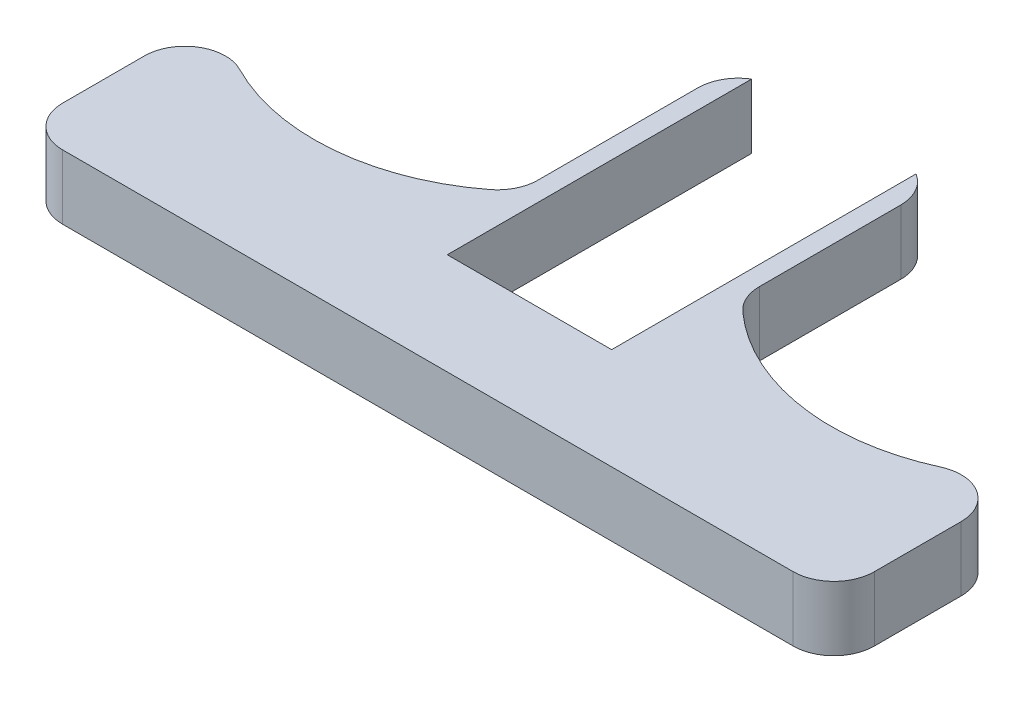
ISO-10303-21;
HEADER;
FILE_DESCRIPTION(('STEP AP214'),'2;1');
FILE_NAME('part.step','',(''),(''),'','','');
FILE_SCHEMA(('AUTOMOTIVE_DESIGN { 1 0 10303 214 1 1 1 1 }'));
ENDSEC;
DATA;
#1=APPLICATION_CONTEXT('core data for automotive mechanical design processes');
#2=APPLICATION_PROTOCOL_DEFINITION('international standard','automotive_design',2000,#1);
#3=PRODUCT_CONTEXT('',#1,'mechanical');
#4=PRODUCT('Part','Part','',(#3));
#5=PRODUCT_RELATED_PRODUCT_CATEGORY('part','',(#4));
#6=PRODUCT_DEFINITION_FORMATION('','',#4);
#7=PRODUCT_DEFINITION_CONTEXT('part definition',#1,'design');
#8=PRODUCT_DEFINITION('design','',#6,#7);
#9=PRODUCT_DEFINITION_SHAPE('','',#8);
#10=(LENGTH_UNIT() NAMED_UNIT(*) SI_UNIT(.MILLI.,.METRE.));
#11=(NAMED_UNIT(*) PLANE_ANGLE_UNIT() SI_UNIT($,.RADIAN.));
#12=(NAMED_UNIT(*) SI_UNIT($,.STERADIAN.) SOLID_ANGLE_UNIT());
#13=UNCERTAINTY_MEASURE_WITH_UNIT(LENGTH_MEASURE(1.E-05),#10,'distance_accuracy_value','');
#14=(GEOMETRIC_REPRESENTATION_CONTEXT(3) GLOBAL_UNCERTAINTY_ASSIGNED_CONTEXT((#13)) GLOBAL_UNIT_ASSIGNED_CONTEXT((#10,
#11,#12)) REPRESENTATION_CONTEXT('',''));
#15=CARTESIAN_POINT('',(0.,0.,0.));
#16=DIRECTION('',(0.,0.,1.));
#17=DIRECTION('',(1.,0.,0.));
#18=AXIS2_PLACEMENT_3D('',#15,#16,#17);
#19=CARTESIAN_POINT('',(0.,3.175,0.));
#20=DIRECTION('',(1.,0.,0.));
#21=DIRECTION('',(0.,0.,-1.));
#22=AXIS2_PLACEMENT_3D('',#19,#20,#21);
#23=PLANE('',#22);
#24=DIRECTION('',(0.,0.,1.));
#25=VECTOR('',#24,1.);
#26=CARTESIAN_POINT('',(0.,0.,0.));
#27=LINE('',#26,#25);
#28=CARTESIAN_POINT('',(0.,0.,-6.02246572622985));
#29=VERTEX_POINT('',#28);
#30=CARTESIAN_POINT('',(0.,0.,-2.));
#31=VERTEX_POINT('',#30);
#32=EDGE_CURVE('E266',#29,#31,#27,.T.);
#33=ORIENTED_EDGE('',*,*,#32,.T.);
#34=DIRECTION('',(0.,-1.,0.));
#35=VECTOR('',#34,1.);
#36=CARTESIAN_POINT('',(0.,3.175,-2.));
#37=LINE('',#36,#35);
#38=CARTESIAN_POINT('',(0.,3.175,-2.));
#39=VERTEX_POINT('',#38);
#40=EDGE_CURVE('E55',#31,#39,#37,.F.);
#41=ORIENTED_EDGE('',*,*,#40,.T.);
#42=DIRECTION('',(0.,0.,1.));
#43=VECTOR('',#42,1.);
#44=CARTESIAN_POINT('',(0.,3.175,0.));
#45=LINE('',#44,#43);
#46=CARTESIAN_POINT('',(0.,3.175,-6.02246572622985));
#47=VERTEX_POINT('',#46);
#48=EDGE_CURVE('E252',#47,#39,#45,.T.);
#49=ORIENTED_EDGE('',*,*,#48,.F.);
#50=DIRECTION('',(0.,-1.,0.));
#51=VECTOR('',#50,1.);
#52=CARTESIAN_POINT('',(0.,3.175,-6.02246572622985));
#53=LINE('',#52,#51);
#54=EDGE_CURVE('E228',#47,#29,#53,.T.);
#55=ORIENTED_EDGE('',*,*,#54,.T.);
#56=EDGE_LOOP('',(#33,#41,#49,#55));
#57=FACE_BOUND('',#56,.T.);
#58=ADVANCED_FACE('F32',(#57),#23,.F.);
#59=CARTESIAN_POINT('',(0.,3.175,0.));
#60=DIRECTION('',(0.,0.,-1.));
#61=DIRECTION('',(-1.,0.,0.));
#62=AXIS2_PLACEMENT_3D('',#59,#60,#61);
#63=PLANE('',#62);
#64=DIRECTION('',(1.,0.,0.));
#65=VECTOR('',#64,1.);
#66=CARTESIAN_POINT('',(0.,3.175,0.));
#67=LINE('',#66,#65);
#68=CARTESIAN_POINT('',(2.,3.175,0.));
#69=VERTEX_POINT('',#68);
#70=CARTESIAN_POINT('',(38.,3.175,0.));
#71=VERTEX_POINT('',#70);
#72=EDGE_CURVE('E251',#69,#71,#67,.T.);
#73=ORIENTED_EDGE('',*,*,#72,.F.);
#74=DIRECTION('',(0.,-1.,0.));
#75=VECTOR('',#74,1.);
#76=CARTESIAN_POINT('',(2.,3.175,0.));
#77=LINE('',#76,#75);
#78=CARTESIAN_POINT('',(2.,0.,0.));
#79=VERTEX_POINT('',#78);
#80=EDGE_CURVE('E241',#69,#79,#77,.T.);
#81=ORIENTED_EDGE('',*,*,#80,.T.);
#82=DIRECTION('',(1.,0.,0.));
#83=VECTOR('',#82,1.);
#84=CARTESIAN_POINT('',(0.,0.,0.));
#85=LINE('',#84,#83);
#86=CARTESIAN_POINT('',(38.,0.,0.));
#87=VERTEX_POINT('',#86);
#88=EDGE_CURVE('E267',#79,#87,#85,.T.);
#89=ORIENTED_EDGE('',*,*,#88,.T.);
#90=DIRECTION('',(0.,-1.,0.));
#91=VECTOR('',#90,1.);
#92=CARTESIAN_POINT('',(38.,3.175,0.));
#93=LINE('',#92,#91);
#94=EDGE_CURVE('E239',#87,#71,#93,.F.);
#95=ORIENTED_EDGE('',*,*,#94,.T.);
#96=EDGE_LOOP('',(#73,#81,#89,#95));
#97=FACE_BOUND('',#96,.T.);
#98=ADVANCED_FACE('F256',(#97),#63,.F.);
#99=CARTESIAN_POINT('',(40.,3.175,0.));
#100=DIRECTION('',(-1.,0.,0.));
#101=DIRECTION('',(0.,0.,1.));
#102=AXIS2_PLACEMENT_3D('',#99,#100,#101);
#103=PLANE('',#102);
#104=DIRECTION('',(0.,0.,-1.));
#105=VECTOR('',#104,1.);
#106=CARTESIAN_POINT('',(40.,3.175,0.));
#107=LINE('',#106,#105);
#108=CARTESIAN_POINT('',(40.,3.175,-2.));
#109=VERTEX_POINT('',#108);
#110=CARTESIAN_POINT('',(40.,3.175,-6.28052182092179));
#111=VERTEX_POINT('',#110);
#112=EDGE_CURVE('E260',#109,#111,#107,.T.);
#113=ORIENTED_EDGE('',*,*,#112,.F.);
#114=DIRECTION('',(0.,-1.,0.));
#115=VECTOR('',#114,1.);
#116=CARTESIAN_POINT('',(40.,3.175,-2.));
#117=LINE('',#116,#115);
#118=CARTESIAN_POINT('',(40.,0.,-2.));
#119=VERTEX_POINT('',#118);
#120=EDGE_CURVE('E11',#109,#119,#117,.T.);
#121=ORIENTED_EDGE('',*,*,#120,.T.);
#122=DIRECTION('',(0.,0.,-1.));
#123=VECTOR('',#122,1.);
#124=CARTESIAN_POINT('',(40.,0.,0.));
#125=LINE('',#124,#123);
#126=CARTESIAN_POINT('',(40.,0.,-6.28052182092179));
#127=VERTEX_POINT('',#126);
#128=EDGE_CURVE('E270',#119,#127,#125,.T.);
#129=ORIENTED_EDGE('',*,*,#128,.T.);
#130=DIRECTION('',(0.,-1.,0.));
#131=VECTOR('',#130,1.);
#132=CARTESIAN_POINT('',(40.,3.175,-6.28052182092179));
#133=LINE('',#132,#131);
#134=EDGE_CURVE('E236',#127,#111,#133,.F.);
#135=ORIENTED_EDGE('',*,*,#134,.T.);
#136=EDGE_LOOP('',(#113,#121,#129,#135));
#137=FACE_BOUND('',#136,.T.);
#138=ADVANCED_FACE('F330',(#137),#103,.F.);
#139=CARTESIAN_POINT('',(32.75,3.175,-17.741931283601));
#140=DIRECTION('',(0.,-1.,0.));
#141=DIRECTION('',(0.,0.,-1.));
#142=AXIS2_PLACEMENT_3D('',#139,#140,#141);
#143=CYLINDRICAL_SURFACE('',#142,10.6066017177982);
#144=CARTESIAN_POINT('',(32.75,3.175,-17.741931283601));
#145=DIRECTION('',(0.,-1.,0.));
#146=DIRECTION('',(0.,0.,-1.));
#147=AXIS2_PLACEMENT_3D('',#144,#145,#146);
#148=CIRCLE('',#147,10.6066017177982);
#149=CARTESIAN_POINT('',(37.1671030595679,3.175,-8.09884046368463));
#150=VERTEX_POINT('',#149);
#151=CARTESIAN_POINT('',(25.663816407791,3.175,-9.84978315413032));
#152=VERTEX_POINT('',#151);
#153=EDGE_CURVE('E322',#150,#152,#148,.T.);
#154=ORIENTED_EDGE('',*,*,#153,.F.);
#155=DIRECTION('',(0.,-1.,0.));
#156=VECTOR('',#155,1.);
#157=CARTESIAN_POINT('',(37.1671030595679,3.175,-8.09884046368463));
#158=LINE('',#157,#156);
#159=CARTESIAN_POINT('',(37.1671030595679,0.,-8.09884046368463));
#160=VERTEX_POINT('',#159);
#161=EDGE_CURVE('E233',#150,#160,#158,.T.);
#162=ORIENTED_EDGE('',*,*,#161,.T.);
#163=CARTESIAN_POINT('',(32.75,0.,-17.741931283601));
#164=DIRECTION('',(0.,-1.,0.));
#165=DIRECTION('',(0.,0.,-1.));
#166=AXIS2_PLACEMENT_3D('',#163,#164,#165);
#167=CIRCLE('',#166,10.6066017177982);
#168=CARTESIAN_POINT('',(25.663816407791,0.,-9.84978315413032));
#169=VERTEX_POINT('',#168);
#170=EDGE_CURVE('E277',#160,#169,#167,.T.);
#171=ORIENTED_EDGE('',*,*,#170,.T.);
#172=DIRECTION('',(0.,-1.,0.));
#173=VECTOR('',#172,1.);
#174=CARTESIAN_POINT('',(25.663816407791,3.175,-9.84978315413032));
#175=LINE('',#174,#173);
#176=EDGE_CURVE('E198',#169,#152,#175,.F.);
#177=ORIENTED_EDGE('',*,*,#176,.T.);
#178=EDGE_LOOP('',(#154,#162,#171,#177));
#179=FACE_BOUND('',#178,.T.);
#180=ADVANCED_FACE('F337',(#179),#143,.F.);
#181=CARTESIAN_POINT('',(25.,3.175,-20.0021468283073));
#182=DIRECTION('',(-1.,0.,0.));
#183=DIRECTION('',(0.,0.,1.));
#184=AXIS2_PLACEMENT_3D('',#181,#182,#183);
#185=PLANE('',#184);
#186=DIRECTION('',(0.,0.,-1.));
#187=VECTOR('',#186,1.);
#188=CARTESIAN_POINT('',(25.,0.,-20.0021468283073));
#189=LINE('',#188,#187);
#190=CARTESIAN_POINT('',(25.,0.,-11.3379408769243));
#191=VERTEX_POINT('',#190);
#192=CARTESIAN_POINT('',(25.,0.,-18.2999423752524));
#193=VERTEX_POINT('',#192);
#194=EDGE_CURVE('E279',#191,#193,#189,.T.);
#195=ORIENTED_EDGE('',*,*,#194,.T.);
#196=DIRECTION('',(0.,1.,0.));
#197=VECTOR('',#196,1.);
#198=CARTESIAN_POINT('',(25.,3.175,-18.2999423752524));
#199=LINE('',#198,#197);
#200=CARTESIAN_POINT('',(25.,3.175,-18.2999423752524));
#201=VERTEX_POINT('',#200);
#202=EDGE_CURVE('E219',#193,#201,#199,.T.);
#203=ORIENTED_EDGE('',*,*,#202,.T.);
#204=DIRECTION('',(0.,0.,-1.));
#205=VECTOR('',#204,1.);
#206=CARTESIAN_POINT('',(25.,3.175,-20.0021468283073));
#207=LINE('',#206,#205);
#208=CARTESIAN_POINT('',(25.,3.175,-11.3379408769243));
#209=VERTEX_POINT('',#208);
#210=EDGE_CURVE('E165',#209,#201,#207,.T.);
#211=ORIENTED_EDGE('',*,*,#210,.F.);
#212=DIRECTION('',(0.,1.,0.));
#213=VECTOR('',#212,1.);
#214=CARTESIAN_POINT('',(25.,0.,-11.3379408769243));
#215=LINE('',#214,#213);
#216=EDGE_CURVE('E195',#209,#191,#215,.F.);
#217=ORIENTED_EDGE('',*,*,#216,.T.);
#218=EDGE_LOOP('',(#195,#203,#211,#217));
#219=FACE_BOUND('',#218,.T.);
#220=ADVANCED_FACE('F345',(#219),#185,.F.);
#221=CARTESIAN_POINT('',(24.05,3.175,-20.0021468283073));
#222=DIRECTION('',(1.,0.,0.));
#223=DIRECTION('',(0.,0.,-1.));
#224=AXIS2_PLACEMENT_3D('',#221,#222,#223);
#225=PLANE('',#224);
#226=DIRECTION('',(0.,0.,1.));
#227=VECTOR('',#226,1.);
#228=CARTESIAN_POINT('',(24.05,0.,-20.0021468283073));
#229=LINE('',#228,#227);
#230=CARTESIAN_POINT('',(24.05,0.,-20.0021468283073));
#231=VERTEX_POINT('',#230);
#232=CARTESIAN_POINT('',(24.05,0.,-5.00214682830731));
#233=VERTEX_POINT('',#232);
#234=EDGE_CURVE('E282',#231,#233,#229,.T.);
#235=ORIENTED_EDGE('',*,*,#234,.T.);
#236=DIRECTION('',(0.,-1.,0.));
#237=VECTOR('',#236,1.);
#238=CARTESIAN_POINT('',(24.05,3.175,-5.00214682830731));
#239=LINE('',#238,#237);
#240=CARTESIAN_POINT('',(24.05,3.175,-5.00214682830731));
#241=VERTEX_POINT('',#240);
#242=EDGE_CURVE('E178',#241,#233,#239,.T.);
#243=ORIENTED_EDGE('',*,*,#242,.F.);
#244=DIRECTION('',(0.,0.,1.));
#245=VECTOR('',#244,1.);
#246=CARTESIAN_POINT('',(24.05,3.175,-20.0021468283073));
#247=LINE('',#246,#245);
#248=CARTESIAN_POINT('',(24.05,3.175,-20.0021468283073));
#249=VERTEX_POINT('',#248);
#250=EDGE_CURVE('E162',#249,#241,#247,.T.);
#251=ORIENTED_EDGE('',*,*,#250,.F.);
#252=DIRECTION('',(0.,-1.,0.));
#253=VECTOR('',#252,1.);
#254=CARTESIAN_POINT('',(24.05,3.175,-20.0021468283073));
#255=LINE('',#254,#253);
#256=EDGE_CURVE('E175',#249,#231,#255,.T.);
#257=ORIENTED_EDGE('',*,*,#256,.T.);
#258=EDGE_LOOP('',(#235,#243,#251,#257));
#259=FACE_BOUND('',#258,.T.);
#260=ADVANCED_FACE('F174',(#259),#225,.F.);
#261=CARTESIAN_POINT('',(15.95,3.175,-5.00214682830731));
#262=DIRECTION('',(0.,0.,1.));
#263=DIRECTION('',(1.,0.,0.));
#264=AXIS2_PLACEMENT_3D('',#261,#262,#263);
#265=PLANE('',#264);
#266=DIRECTION('',(-1.,0.,0.));
#267=VECTOR('',#266,1.);
#268=CARTESIAN_POINT('',(15.95,0.,-5.00214682830731));
#269=LINE('',#268,#267);
#270=CARTESIAN_POINT('',(15.95,0.,-5.00214682830731));
#271=VERTEX_POINT('',#270);
#272=EDGE_CURVE('E284',#233,#271,#269,.T.);
#273=ORIENTED_EDGE('',*,*,#272,.T.);
#274=DIRECTION('',(0.,-1.,0.));
#275=VECTOR('',#274,1.);
#276=CARTESIAN_POINT('',(15.95,3.175,-5.00214682830731));
#277=LINE('',#276,#275);
#278=CARTESIAN_POINT('',(15.95,3.175,-5.00214682830731));
#279=VERTEX_POINT('',#278);
#280=EDGE_CURVE('E189',#279,#271,#277,.T.);
#281=ORIENTED_EDGE('',*,*,#280,.F.);
#282=DIRECTION('',(-1.,0.,0.));
#283=VECTOR('',#282,1.);
#284=CARTESIAN_POINT('',(15.95,3.175,-5.00214682830731));
#285=LINE('',#284,#283);
#286=EDGE_CURVE('E180',#241,#279,#285,.T.);
#287=ORIENTED_EDGE('',*,*,#286,.F.);
#288=ORIENTED_EDGE('',*,*,#242,.T.);
#289=EDGE_LOOP('',(#273,#281,#287,#288));
#290=FACE_BOUND('',#289,.T.);
#291=ADVANCED_FACE('F352',(#290),#265,.F.);
#292=CARTESIAN_POINT('',(15.95,3.175,-20.0021468283073));
#293=DIRECTION('',(-1.,0.,0.));
#294=DIRECTION('',(0.,0.,1.));
#295=AXIS2_PLACEMENT_3D('',#292,#293,#294);
#296=PLANE('',#295);
#297=DIRECTION('',(0.,0.,-1.));
#298=VECTOR('',#297,1.);
#299=CARTESIAN_POINT('',(15.95,0.,-20.0021468283073));
#300=LINE('',#299,#298);
#301=CARTESIAN_POINT('',(15.95,0.,-20.0021468283073));
#302=VERTEX_POINT('',#301);
#303=EDGE_CURVE('E286',#271,#302,#300,.T.);
#304=ORIENTED_EDGE('',*,*,#303,.T.);
#305=DIRECTION('',(0.,-1.,0.));
#306=VECTOR('',#305,1.);
#307=CARTESIAN_POINT('',(15.95,3.175,-20.0021468283073));
#308=LINE('',#307,#306);
#309=CARTESIAN_POINT('',(15.95,3.175,-20.0021468283073));
#310=VERTEX_POINT('',#309);
#311=EDGE_CURVE('E294',#310,#302,#308,.T.);
#312=ORIENTED_EDGE('',*,*,#311,.F.);
#313=DIRECTION('',(0.,0.,-1.));
#314=VECTOR('',#313,1.);
#315=CARTESIAN_POINT('',(15.95,3.175,-20.0021468283073));
#316=LINE('',#315,#314);
#317=EDGE_CURVE('E303',#279,#310,#316,.T.);
#318=ORIENTED_EDGE('',*,*,#317,.F.);
#319=ORIENTED_EDGE('',*,*,#280,.T.);
#320=EDGE_LOOP('',(#304,#312,#318,#319));
#321=FACE_BOUND('',#320,.T.);
#322=ADVANCED_FACE('F301',(#321),#296,.F.);
#323=CARTESIAN_POINT('',(15.,3.175,-9.49944289537914));
#324=DIRECTION('',(1.,0.,0.));
#325=DIRECTION('',(0.,0.,-1.));
#326=AXIS2_PLACEMENT_3D('',#323,#324,#325);
#327=PLANE('',#326);
#328=DIRECTION('',(0.,0.,1.));
#329=VECTOR('',#328,1.);
#330=CARTESIAN_POINT('',(15.,3.175,-9.49944289537914));
#331=LINE('',#330,#329);
#332=CARTESIAN_POINT('',(15.,3.175,-18.2999423752524));
#333=VERTEX_POINT('',#332);
#334=CARTESIAN_POINT('',(15.,3.175,-10.4214699913242));
#335=VERTEX_POINT('',#334);
#336=EDGE_CURVE('E314',#333,#335,#331,.T.);
#337=ORIENTED_EDGE('',*,*,#336,.F.);
#338=DIRECTION('',(0.,-1.,0.));
#339=VECTOR('',#338,1.);
#340=CARTESIAN_POINT('',(15.,3.175,-18.2999423752524));
#341=LINE('',#340,#339);
#342=CARTESIAN_POINT('',(15.,0.,-18.2999423752524));
#343=VERTEX_POINT('',#342);
#344=EDGE_CURVE('E169',#333,#343,#341,.T.);
#345=ORIENTED_EDGE('',*,*,#344,.T.);
#346=DIRECTION('',(0.,0.,1.));
#347=VECTOR('',#346,1.);
#348=CARTESIAN_POINT('',(15.,0.,-9.49944289537914));
#349=LINE('',#348,#347);
#350=CARTESIAN_POINT('',(15.,0.,-10.4214699913242));
#351=VERTEX_POINT('',#350);
#352=EDGE_CURVE('E289',#343,#351,#349,.T.);
#353=ORIENTED_EDGE('',*,*,#352,.T.);
#354=DIRECTION('',(0.,1.,0.));
#355=VECTOR('',#354,1.);
#356=CARTESIAN_POINT('',(15.,3.175,-10.4214699913242));
#357=LINE('',#356,#355);
#358=EDGE_CURVE('E187',#351,#335,#357,.T.);
#359=ORIENTED_EDGE('',*,*,#358,.T.);
#360=EDGE_LOOP('',(#337,#345,#353,#359));
#361=FACE_BOUND('',#360,.T.);
#362=ADVANCED_FACE('F313',(#361),#327,.F.);
#363=CARTESIAN_POINT('',(7.75,3.175,-17.2413741789804));
#364=DIRECTION('',(0.,-1.,0.));
#365=DIRECTION('',(0.,0.,-1.));
#366=AXIS2_PLACEMENT_3D('',#363,#364,#365);
#367=CYLINDRICAL_SURFACE('',#366,10.6066017177984);
#368=CARTESIAN_POINT('',(7.75,0.,-17.2413741789804));
#369=DIRECTION('',(0.,-1.,0.));
#370=DIRECTION('',(0.,0.,-1.));
#371=AXIS2_PLACEMENT_3D('',#368,#369,#370);
#372=CIRCLE('',#371,10.6066017177984);
#373=CARTESIAN_POINT('',(14.2199937146256,0.,-8.83666232593576));
#374=VERTEX_POINT('',#373);
#375=CARTESIAN_POINT('',(2.91222045856846,0.,-7.80231230247432));
#376=VERTEX_POINT('',#375);
#377=EDGE_CURVE('E291',#374,#376,#372,.T.);
#378=ORIENTED_EDGE('',*,*,#377,.T.);
#379=DIRECTION('',(0.,-1.,0.));
#380=VECTOR('',#379,1.);
#381=CARTESIAN_POINT('',(2.91222045856846,3.175,-7.80231230247432));
#382=LINE('',#381,#380);
#383=CARTESIAN_POINT('',(2.91222045856846,3.175,-7.80231230247432));
#384=VERTEX_POINT('',#383);
#385=EDGE_CURVE('E231',#376,#384,#382,.F.);
#386=ORIENTED_EDGE('',*,*,#385,.T.);
#387=CARTESIAN_POINT('',(7.75,3.175,-17.2413741789804));
#388=DIRECTION('',(0.,-1.,0.));
#389=DIRECTION('',(0.,0.,-1.));
#390=AXIS2_PLACEMENT_3D('',#387,#388,#389);
#391=CIRCLE('',#390,10.6066017177984);
#392=CARTESIAN_POINT('',(14.2199937146256,3.175,-8.83666232593576));
#393=VERTEX_POINT('',#392);
#394=EDGE_CURVE('E273',#393,#384,#391,.T.);
#395=ORIENTED_EDGE('',*,*,#394,.F.);
#396=DIRECTION('',(0.,-1.,0.));
#397=VECTOR('',#396,1.);
#398=CARTESIAN_POINT('',(14.2199937146256,3.175,-8.83666232593576));
#399=LINE('',#398,#397);
#400=EDGE_CURVE('E184',#393,#374,#399,.T.);
#401=ORIENTED_EDGE('',*,*,#400,.T.);
#402=EDGE_LOOP('',(#378,#386,#395,#401));
#403=FACE_BOUND('',#402,.T.);
#404=ADVANCED_FACE('F408',(#403),#367,.F.);
#405=CARTESIAN_POINT('',(7.75,3.175,-17.2413741789804));
#406=DIRECTION('',(0.,-1.,0.));
#407=DIRECTION('',(0.,0.,-1.));
#408=AXIS2_PLACEMENT_3D('',#405,#406,#407);
#409=PLANE('',#408);
#410=ORIENTED_EDGE('',*,*,#48,.T.);
#411=CARTESIAN_POINT('',(2.,3.175,-2.));
#412=DIRECTION('',(0.,-1.,0.));
#413=DIRECTION('',(0.,0.,-1.));
#414=AXIS2_PLACEMENT_3D('',#411,#412,#413);
#415=CIRCLE('',#414,2.);
#416=EDGE_CURVE('E40',#39,#69,#415,.F.);
#417=ORIENTED_EDGE('',*,*,#416,.T.);
#418=ORIENTED_EDGE('',*,*,#72,.T.);
#419=CARTESIAN_POINT('',(38.,3.175,-2.));
#420=DIRECTION('',(0.,-1.,0.));
#421=DIRECTION('',(0.,0.,-1.));
#422=AXIS2_PLACEMENT_3D('',#419,#420,#421);
#423=CIRCLE('',#422,2.);
#424=EDGE_CURVE('E47',#71,#109,#423,.F.);
#425=ORIENTED_EDGE('',*,*,#424,.T.);
#426=ORIENTED_EDGE('',*,*,#112,.T.);
#427=CARTESIAN_POINT('',(38.,3.175,-6.28052182092179));
#428=DIRECTION('',(0.,-1.,0.));
#429=DIRECTION('',(0.,0.,-1.));
#430=AXIS2_PLACEMENT_3D('',#427,#428,#429);
#431=CIRCLE('',#430,2.);
#432=EDGE_CURVE('E221',#111,#150,#431,.F.);
#433=ORIENTED_EDGE('',*,*,#432,.T.);
#434=ORIENTED_EDGE('',*,*,#153,.T.);
#435=CARTESIAN_POINT('',(27.,3.175,-11.3379408769243));
#436=DIRECTION('',(0.,-1.,0.));
#437=DIRECTION('',(0.,0.,-1.));
#438=AXIS2_PLACEMENT_3D('',#435,#436,#437);
#439=CIRCLE('',#438,2.);
#440=EDGE_CURVE('E209',#152,#209,#439,.T.);
#441=ORIENTED_EDGE('',*,*,#440,.T.);
#442=ORIENTED_EDGE('',*,*,#210,.T.);
#443=CARTESIAN_POINT('',(23.,3.175,-18.2999423752524));
#444=DIRECTION('',(0.,-1.,0.));
#445=DIRECTION('',(0.,0.,-1.));
#446=AXIS2_PLACEMENT_3D('',#443,#444,#445);
#447=CIRCLE('',#446,2.);
#448=EDGE_CURVE('E159',#201,#249,#447,.F.);
#449=ORIENTED_EDGE('',*,*,#448,.T.);
#450=ORIENTED_EDGE('',*,*,#250,.T.);
#451=ORIENTED_EDGE('',*,*,#286,.T.);
#452=ORIENTED_EDGE('',*,*,#317,.T.);
#453=CARTESIAN_POINT('',(17.,3.175,-18.2999423752524));
#454=DIRECTION('',(0.,-1.,0.));
#455=DIRECTION('',(0.,0.,-1.));
#456=AXIS2_PLACEMENT_3D('',#453,#454,#455);
#457=CIRCLE('',#456,2.);
#458=EDGE_CURVE('E170',#310,#333,#457,.F.);
#459=ORIENTED_EDGE('',*,*,#458,.T.);
#460=ORIENTED_EDGE('',*,*,#336,.T.);
#461=CARTESIAN_POINT('',(13.,3.175,-10.4214699913242));
#462=DIRECTION('',(0.,-1.,0.));
#463=DIRECTION('',(0.,0.,-1.));
#464=AXIS2_PLACEMENT_3D('',#461,#462,#463);
#465=CIRCLE('',#464,2.);
#466=EDGE_CURVE('E204',#335,#393,#465,.T.);
#467=ORIENTED_EDGE('',*,*,#466,.T.);
#468=ORIENTED_EDGE('',*,*,#394,.T.);
#469=CARTESIAN_POINT('',(2.,3.175,-6.02246572622985));
#470=DIRECTION('',(0.,-1.,0.));
#471=DIRECTION('',(0.,0.,-1.));
#472=AXIS2_PLACEMENT_3D('',#469,#470,#471);
#473=CIRCLE('',#472,2.);
#474=EDGE_CURVE('E223',#384,#47,#473,.F.);
#475=ORIENTED_EDGE('',*,*,#474,.T.);
#476=EDGE_LOOP('',(#410,#417,#418,#425,#426,#433,#434,#441,#442,#449,#450,#451,#452,#459,#460,
#467,#468,#475));
#477=FACE_BOUND('',#476,.T.);
#478=ADVANCED_FACE('F161',(#477),#409,.F.);
#479=CARTESIAN_POINT('',(7.75,0.,-17.2413741789804));
#480=DIRECTION('',(0.,-1.,0.));
#481=DIRECTION('',(0.,0.,-1.));
#482=AXIS2_PLACEMENT_3D('',#479,#480,#481);
#483=PLANE('',#482);
#484=ORIENTED_EDGE('',*,*,#88,.F.);
#485=CARTESIAN_POINT('',(2.,0.,-2.));
#486=DIRECTION('',(0.,-1.,0.));
#487=DIRECTION('',(0.,0.,-1.));
#488=AXIS2_PLACEMENT_3D('',#485,#486,#487);
#489=CIRCLE('',#488,2.);
#490=EDGE_CURVE('E246',#79,#31,#489,.T.);
#491=ORIENTED_EDGE('',*,*,#490,.T.);
#492=ORIENTED_EDGE('',*,*,#32,.F.);
#493=CARTESIAN_POINT('',(2.,0.,-6.02246572622985));
#494=DIRECTION('',(0.,-1.,0.));
#495=DIRECTION('',(0.,0.,-1.));
#496=AXIS2_PLACEMENT_3D('',#493,#494,#495);
#497=CIRCLE('',#496,2.);
#498=EDGE_CURVE('E214',#29,#376,#497,.T.);
#499=ORIENTED_EDGE('',*,*,#498,.T.);
#500=ORIENTED_EDGE('',*,*,#377,.F.);
#501=CARTESIAN_POINT('',(13.,0.,-10.4214699913242));
#502=DIRECTION('',(0.,-1.,0.));
#503=DIRECTION('',(0.,0.,-1.));
#504=AXIS2_PLACEMENT_3D('',#501,#502,#503);
#505=CIRCLE('',#504,2.);
#506=EDGE_CURVE('E201',#374,#351,#505,.F.);
#507=ORIENTED_EDGE('',*,*,#506,.T.);
#508=ORIENTED_EDGE('',*,*,#352,.F.);
#509=CARTESIAN_POINT('',(17.,0.,-18.2999423752524));
#510=DIRECTION('',(0.,-1.,0.));
#511=DIRECTION('',(0.,0.,-1.));
#512=AXIS2_PLACEMENT_3D('',#509,#510,#511);
#513=CIRCLE('',#512,2.);
#514=EDGE_CURVE('E216',#343,#302,#513,.T.);
#515=ORIENTED_EDGE('',*,*,#514,.T.);
#516=ORIENTED_EDGE('',*,*,#303,.F.);
#517=ORIENTED_EDGE('',*,*,#272,.F.);
#518=ORIENTED_EDGE('',*,*,#234,.F.);
#519=CARTESIAN_POINT('',(23.,0.,-18.2999423752524));
#520=DIRECTION('',(0.,-1.,0.));
#521=DIRECTION('',(0.,0.,-1.));
#522=AXIS2_PLACEMENT_3D('',#519,#520,#521);
#523=CIRCLE('',#522,2.);
#524=EDGE_CURVE('E183',#231,#193,#523,.T.);
#525=ORIENTED_EDGE('',*,*,#524,.T.);
#526=ORIENTED_EDGE('',*,*,#194,.F.);
#527=CARTESIAN_POINT('',(27.,0.,-11.3379408769243));
#528=DIRECTION('',(0.,-1.,0.));
#529=DIRECTION('',(0.,0.,-1.));
#530=AXIS2_PLACEMENT_3D('',#527,#528,#529);
#531=CIRCLE('',#530,2.);
#532=EDGE_CURVE('E206',#191,#169,#531,.F.);
#533=ORIENTED_EDGE('',*,*,#532,.T.);
#534=ORIENTED_EDGE('',*,*,#170,.F.);
#535=CARTESIAN_POINT('',(38.,0.,-6.28052182092179));
#536=DIRECTION('',(0.,-1.,0.));
#537=DIRECTION('',(0.,0.,-1.));
#538=AXIS2_PLACEMENT_3D('',#535,#536,#537);
#539=CIRCLE('',#538,2.);
#540=EDGE_CURVE('E211',#160,#127,#539,.T.);
#541=ORIENTED_EDGE('',*,*,#540,.T.);
#542=ORIENTED_EDGE('',*,*,#128,.F.);
#543=CARTESIAN_POINT('',(38.,0.,-2.));
#544=DIRECTION('',(0.,-1.,0.));
#545=DIRECTION('',(0.,0.,-1.));
#546=AXIS2_PLACEMENT_3D('',#543,#544,#545);
#547=CIRCLE('',#546,2.);
#548=EDGE_CURVE('E244',#119,#87,#547,.T.);
#549=ORIENTED_EDGE('',*,*,#548,.T.);
#550=EDGE_LOOP('',(#484,#491,#492,#499,#500,#507,#508,#515,#516,#517,#518,#525,#526,#533,#534,
#541,#542,#549));
#551=FACE_BOUND('',#550,.T.);
#552=ADVANCED_FACE('F265',(#551),#483,.T.);
#553=CARTESIAN_POINT('',(13.,3.175,-10.4214699913242));
#554=DIRECTION('',(0.,-1.,0.));
#555=DIRECTION('',(0.,0.,-1.));
#556=AXIS2_PLACEMENT_3D('',#553,#554,#555);
#557=CYLINDRICAL_SURFACE('',#556,2.);
#558=ORIENTED_EDGE('',*,*,#466,.F.);
#559=ORIENTED_EDGE('',*,*,#358,.F.);
#560=ORIENTED_EDGE('',*,*,#506,.F.);
#561=ORIENTED_EDGE('',*,*,#400,.F.);
#562=EDGE_LOOP('',(#558,#559,#560,#561));
#563=FACE_BOUND('',#562,.T.);
#564=ADVANCED_FACE('F363',(#563),#557,.F.);
#565=CARTESIAN_POINT('',(27.,3.175,-11.3379408769243));
#566=DIRECTION('',(0.,-1.,0.));
#567=DIRECTION('',(0.,0.,-1.));
#568=AXIS2_PLACEMENT_3D('',#565,#566,#567);
#569=CYLINDRICAL_SURFACE('',#568,2.);
#570=ORIENTED_EDGE('',*,*,#440,.F.);
#571=ORIENTED_EDGE('',*,*,#176,.F.);
#572=ORIENTED_EDGE('',*,*,#532,.F.);
#573=ORIENTED_EDGE('',*,*,#216,.F.);
#574=EDGE_LOOP('',(#570,#571,#572,#573));
#575=FACE_BOUND('',#574,.T.);
#576=ADVANCED_FACE('F343',(#575),#569,.F.);
#577=CARTESIAN_POINT('',(23.,3.175,-18.2999423752524));
#578=DIRECTION('',(0.,1.,0.));
#579=DIRECTION('',(0.,0.,1.));
#580=AXIS2_PLACEMENT_3D('',#577,#578,#579);
#581=CYLINDRICAL_SURFACE('',#580,2.);
#582=ORIENTED_EDGE('',*,*,#448,.F.);
#583=ORIENTED_EDGE('',*,*,#202,.F.);
#584=ORIENTED_EDGE('',*,*,#524,.F.);
#585=ORIENTED_EDGE('',*,*,#256,.F.);
#586=EDGE_LOOP('',(#582,#583,#584,#585));
#587=FACE_BOUND('',#586,.T.);
#588=ADVANCED_FACE('F182',(#587),#581,.T.);
#589=CARTESIAN_POINT('',(17.,3.175,-18.2999423752524));
#590=DIRECTION('',(0.,-1.,0.));
#591=DIRECTION('',(0.,0.,-1.));
#592=AXIS2_PLACEMENT_3D('',#589,#590,#591);
#593=CYLINDRICAL_SURFACE('',#592,2.);
#594=ORIENTED_EDGE('',*,*,#458,.F.);
#595=ORIENTED_EDGE('',*,*,#311,.T.);
#596=ORIENTED_EDGE('',*,*,#514,.F.);
#597=ORIENTED_EDGE('',*,*,#344,.F.);
#598=EDGE_LOOP('',(#594,#595,#596,#597));
#599=FACE_BOUND('',#598,.T.);
#600=ADVANCED_FACE('F310',(#599),#593,.T.);
#601=CARTESIAN_POINT('',(2.,3.175,-6.02246572622985));
#602=DIRECTION('',(0.,-1.,0.));
#603=DIRECTION('',(0.,0.,-1.));
#604=AXIS2_PLACEMENT_3D('',#601,#602,#603);
#605=CYLINDRICAL_SURFACE('',#604,2.);
#606=ORIENTED_EDGE('',*,*,#474,.F.);
#607=ORIENTED_EDGE('',*,*,#385,.F.);
#608=ORIENTED_EDGE('',*,*,#498,.F.);
#609=ORIENTED_EDGE('',*,*,#54,.F.);
#610=EDGE_LOOP('',(#606,#607,#608,#609));
#611=FACE_BOUND('',#610,.T.);
#612=ADVANCED_FACE('F373',(#611),#605,.T.);
#613=CARTESIAN_POINT('',(38.,3.175,-6.28052182092179));
#614=DIRECTION('',(0.,-1.,0.));
#615=DIRECTION('',(0.,0.,-1.));
#616=AXIS2_PLACEMENT_3D('',#613,#614,#615);
#617=CYLINDRICAL_SURFACE('',#616,2.);
#618=ORIENTED_EDGE('',*,*,#432,.F.);
#619=ORIENTED_EDGE('',*,*,#134,.F.);
#620=ORIENTED_EDGE('',*,*,#540,.F.);
#621=ORIENTED_EDGE('',*,*,#161,.F.);
#622=EDGE_LOOP('',(#618,#619,#620,#621));
#623=FACE_BOUND('',#622,.T.);
#624=ADVANCED_FACE('F334',(#623),#617,.T.);
#625=CARTESIAN_POINT('',(2.,3.175,-2.));
#626=DIRECTION('',(0.,-1.,0.));
#627=DIRECTION('',(0.,0.,-1.));
#628=AXIS2_PLACEMENT_3D('',#625,#626,#627);
#629=CYLINDRICAL_SURFACE('',#628,2.);
#630=ORIENTED_EDGE('',*,*,#416,.F.);
#631=ORIENTED_EDGE('',*,*,#40,.F.);
#632=ORIENTED_EDGE('',*,*,#490,.F.);
#633=ORIENTED_EDGE('',*,*,#80,.F.);
#634=EDGE_LOOP('',(#630,#631,#632,#633));
#635=FACE_BOUND('',#634,.T.);
#636=ADVANCED_FACE('F262',(#635),#629,.T.);
#637=CARTESIAN_POINT('',(38.,3.175,-2.));
#638=DIRECTION('',(0.,-1.,0.));
#639=DIRECTION('',(0.,0.,-1.));
#640=AXIS2_PLACEMENT_3D('',#637,#638,#639);
#641=CYLINDRICAL_SURFACE('',#640,2.);
#642=ORIENTED_EDGE('',*,*,#424,.F.);
#643=ORIENTED_EDGE('',*,*,#94,.F.);
#644=ORIENTED_EDGE('',*,*,#548,.F.);
#645=ORIENTED_EDGE('',*,*,#120,.F.);
#646=EDGE_LOOP('',(#642,#643,#644,#645));
#647=FACE_BOUND('',#646,.T.);
#648=ADVANCED_FACE('F34',(#647),#641,.T.);
#649=CLOSED_SHELL('',(#58,#98,#138,#180,#220,#260,#291,#322,#362,#404,#478,#552,#564,#576,#588,
#600,#612,#624,#636,#648));
#650=MANIFOLD_SOLID_BREP('B2',#649);
#651=ADVANCED_BREP_SHAPE_REPRESENTATION('',(#18,#650),#14);
#652=SHAPE_DEFINITION_REPRESENTATION(#9,#651);
ENDSEC;
END-ISO-10303-21;
